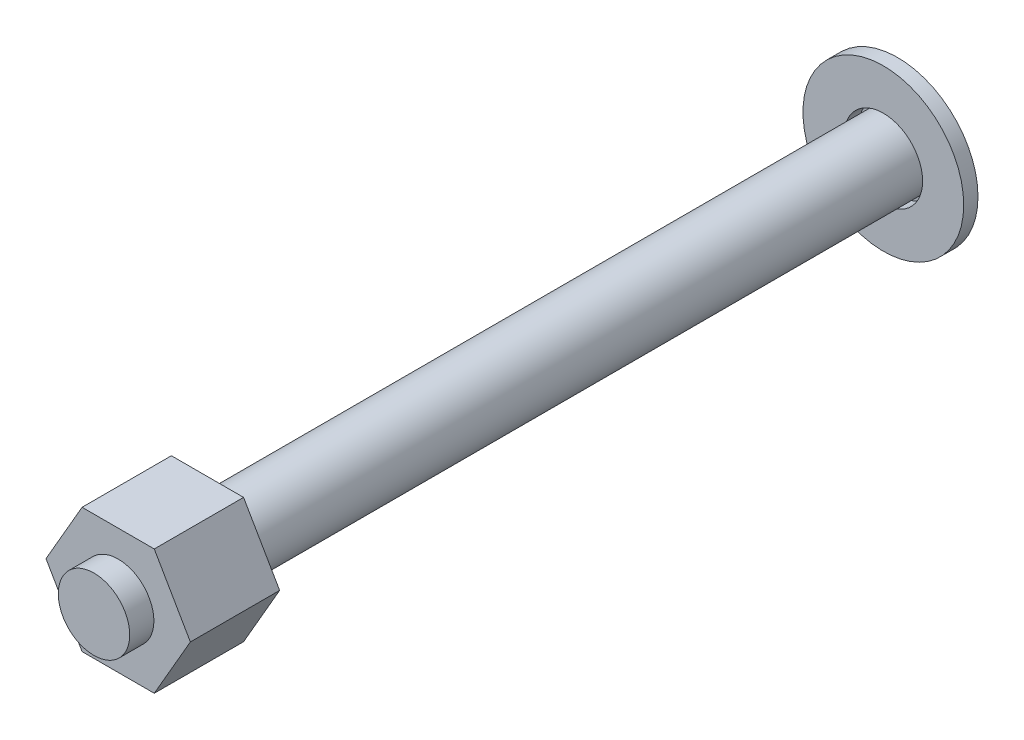
ISO-10303-21;
HEADER;
FILE_DESCRIPTION(('STEP AP214'),'2;1');
FILE_NAME('part.step','',(''),(''),'','','');
FILE_SCHEMA(('AUTOMOTIVE_DESIGN { 1 0 10303 214 1 1 1 1 }'));
ENDSEC;
DATA;
#1=APPLICATION_CONTEXT('core data for automotive mechanical design processes');
#2=APPLICATION_PROTOCOL_DEFINITION('international standard','automotive_design',2000,#1);
#3=PRODUCT_CONTEXT('',#1,'mechanical');
#4=PRODUCT('Part','Part','',(#3));
#5=PRODUCT_RELATED_PRODUCT_CATEGORY('part','',(#4));
#6=PRODUCT_DEFINITION_FORMATION('','',#4);
#7=PRODUCT_DEFINITION_CONTEXT('part definition',#1,'design');
#8=PRODUCT_DEFINITION('design','',#6,#7);
#9=PRODUCT_DEFINITION_SHAPE('','',#8);
#10=(LENGTH_UNIT() NAMED_UNIT(*) SI_UNIT(.MILLI.,.METRE.));
#11=(NAMED_UNIT(*) PLANE_ANGLE_UNIT() SI_UNIT($,.RADIAN.));
#12=(NAMED_UNIT(*) SI_UNIT($,.STERADIAN.) SOLID_ANGLE_UNIT());
#13=UNCERTAINTY_MEASURE_WITH_UNIT(LENGTH_MEASURE(1.E-05),#10,'distance_accuracy_value','');
#14=(GEOMETRIC_REPRESENTATION_CONTEXT(3) GLOBAL_UNCERTAINTY_ASSIGNED_CONTEXT((#13)) GLOBAL_UNIT_ASSIGNED_CONTEXT((#10,
#11,#12)) REPRESENTATION_CONTEXT('',''));
#15=CARTESIAN_POINT('',(0.,0.,0.));
#16=DIRECTION('',(0.,0.,1.));
#17=DIRECTION('',(1.,0.,0.));
#18=AXIS2_PLACEMENT_3D('',#15,#16,#17);
#19=CARTESIAN_POINT('',(48.7,-49.3,71.2));
#20=DIRECTION('',(0.,0.,1.));
#21=DIRECTION('',(1.,0.,0.));
#22=AXIS2_PLACEMENT_3D('',#19,#20,#21);
#23=PLANE('',#22);
#24=CARTESIAN_POINT('',(48.7,-49.3,71.2));
#25=DIRECTION('',(0.,0.,-1.));
#26=DIRECTION('',(1.,0.,0.));
#27=AXIS2_PLACEMENT_3D('',#24,#25,#26);
#28=CIRCLE('',#27,2.);
#29=CARTESIAN_POINT('',(50.7,-49.3,71.2));
#30=VERTEX_POINT('',#29);
#31=EDGE_CURVE('E9',#30,#30,#28,.T.);
#32=ORIENTED_EDGE('',*,*,#31,.F.);
#33=EDGE_LOOP('',(#32));
#34=FACE_BOUND('',#33,.T.);
#35=ADVANCED_FACE('F14',(#34),#23,.T.);
#36=CARTESIAN_POINT('',(48.7,-49.3,26.2));
#37=DIRECTION('',(0.,0.,1.));
#38=DIRECTION('',(1.,0.,0.));
#39=AXIS2_PLACEMENT_3D('',#36,#37,#38);
#40=CYLINDRICAL_SURFACE('',#39,2.);
#41=CARTESIAN_POINT('',(48.7,-49.3,69.844831730769));
#42=DIRECTION('',(0.,0.,-1.));
#43=DIRECTION('',(1.,0.,0.));
#44=AXIS2_PLACEMENT_3D('',#41,#42,#43);
#45=CIRCLE('',#44,2.);
#46=CARTESIAN_POINT('',(50.7,-49.3,69.844831730769));
#47=VERTEX_POINT('',#46);
#48=EDGE_CURVE('E221',#47,#47,#45,.T.);
#49=ORIENTED_EDGE('',*,*,#48,.F.);
#50=DIRECTION('',(0.,0.,1.));
#51=VECTOR('',#50,1.);
#52=CARTESIAN_POINT('',(50.7,-49.3,26.2));
#53=LINE('',#52,#51);
#54=EDGE_CURVE('E25',#47,#30,#53,.T.);
#55=ORIENTED_EDGE('',*,*,#54,.T.);
#56=ORIENTED_EDGE('',*,*,#31,.T.);
#57=ORIENTED_EDGE('',*,*,#54,.F.);
#58=EDGE_LOOP('',(#49,#55,#56,#57));
#59=FACE_BOUND('',#58,.T.);
#60=ADVANCED_FACE('F398',(#59),#40,.T.);
#61=CARTESIAN_POINT('',(48.7,-49.3,69.844831730769));
#62=DIRECTION('',(0.,0.,1.));
#63=DIRECTION('',(1.,0.,0.));
#64=AXIS2_PLACEMENT_3D('',#61,#62,#63);
#65=PLANE('',#64);
#66=ORIENTED_EDGE('',*,*,#48,.T.);
#67=EDGE_LOOP('',(#66));
#68=FACE_BOUND('',#67,.T.);
#69=DIRECTION('',(0.50000000000019,-0.866025403784329,0.));
#70=VECTOR('',#69,1.);
#71=CARTESIAN_POINT('',(50.720725942164,-45.8,69.844831730769));
#72=LINE('',#71,#70);
#73=CARTESIAN_POINT('',(50.720725942164,-45.8,69.844831730769));
#74=VERTEX_POINT('',#73);
#75=CARTESIAN_POINT('',(52.741451884327,-49.3,69.844831730769));
#76=VERTEX_POINT('',#75);
#77=EDGE_CURVE('E158',#74,#76,#72,.T.);
#78=ORIENTED_EDGE('',*,*,#77,.F.);
#79=DIRECTION('',(1.,0.,0.));
#80=VECTOR('',#79,1.);
#81=CARTESIAN_POINT('',(46.679274057836,-45.8,69.844831730769));
#82=LINE('',#81,#80);
#83=CARTESIAN_POINT('',(46.679274057836,-45.8,69.844831730769));
#84=VERTEX_POINT('',#83);
#85=EDGE_CURVE('E240',#84,#74,#82,.T.);
#86=ORIENTED_EDGE('',*,*,#85,.F.);
#87=DIRECTION('',(0.50000000000019,0.866025403784329,0.));
#88=VECTOR('',#87,1.);
#89=CARTESIAN_POINT('',(44.658548115673,-49.3,69.844831730769));
#90=LINE('',#89,#88);
#91=CARTESIAN_POINT('',(44.658548115673,-49.3,69.844831730769));
#92=VERTEX_POINT('',#91);
#93=EDGE_CURVE('E219',#92,#84,#90,.T.);
#94=ORIENTED_EDGE('',*,*,#93,.F.);
#95=DIRECTION('',(-0.50000000000019,0.866025403784329,0.));
#96=VECTOR('',#95,1.);
#97=CARTESIAN_POINT('',(46.679274057836,-52.8,69.844831730769));
#98=LINE('',#97,#96);
#99=CARTESIAN_POINT('',(46.679274057836,-52.8,69.844831730769));
#100=VERTEX_POINT('',#99);
#101=EDGE_CURVE('E153',#100,#92,#98,.T.);
#102=ORIENTED_EDGE('',*,*,#101,.F.);
#103=DIRECTION('',(-1.,0.,0.));
#104=VECTOR('',#103,1.);
#105=CARTESIAN_POINT('',(50.720725942164,-52.8,69.844831730769));
#106=LINE('',#105,#104);
#107=CARTESIAN_POINT('',(50.720725942164,-52.8,69.844831730769));
#108=VERTEX_POINT('',#107);
#109=EDGE_CURVE('E145',#108,#100,#106,.T.);
#110=ORIENTED_EDGE('',*,*,#109,.F.);
#111=DIRECTION('',(-0.50000000000019,-0.866025403784329,0.));
#112=VECTOR('',#111,1.);
#113=CARTESIAN_POINT('',(52.741451884327,-49.3,69.844831730769));
#114=LINE('',#113,#112);
#115=EDGE_CURVE('E150',#76,#108,#114,.T.);
#116=ORIENTED_EDGE('',*,*,#115,.F.);
#117=EDGE_LOOP('',(#78,#86,#94,#102,#110,#116));
#118=FACE_BOUND('',#117,.T.);
#119=ADVANCED_FACE('F148',(#68,#118),#65,.T.);
#120=CARTESIAN_POINT('',(44.658548115673,-49.3,64.844831730769));
#121=DIRECTION('',(0.866025403784329,-0.50000000000019,0.));
#122=DIRECTION('',(0.,0.,-1.));
#123=AXIS2_PLACEMENT_3D('',#120,#121,#122);
#124=PLANE('',#123);
#125=DIRECTION('',(0.,0.,1.));
#126=VECTOR('',#125,1.);
#127=CARTESIAN_POINT('',(44.658548115673,-49.3,64.844831730769));
#128=LINE('',#127,#126);
#129=CARTESIAN_POINT('',(44.658548115673,-49.3,64.844831730769));
#130=VERTEX_POINT('',#129);
#131=EDGE_CURVE('E222',#130,#92,#128,.T.);
#132=ORIENTED_EDGE('',*,*,#131,.T.);
#133=ORIENTED_EDGE('',*,*,#93,.T.);
#134=DIRECTION('',(0.,0.,1.));
#135=VECTOR('',#134,1.);
#136=CARTESIAN_POINT('',(46.679274057836,-45.8,64.844831730769));
#137=LINE('',#136,#135);
#138=CARTESIAN_POINT('',(46.679274057836,-45.8,64.844831730769));
#139=VERTEX_POINT('',#138);
#140=EDGE_CURVE('E258',#139,#84,#137,.T.);
#141=ORIENTED_EDGE('',*,*,#140,.F.);
#142=DIRECTION('',(0.50000000000019,0.866025403784329,0.));
#143=VECTOR('',#142,1.);
#144=CARTESIAN_POINT('',(44.658548115673,-49.3,64.844831730769));
#145=LINE('',#144,#143);
#146=EDGE_CURVE('E195',#130,#139,#145,.T.);
#147=ORIENTED_EDGE('',*,*,#146,.F.);
#148=EDGE_LOOP('',(#132,#133,#141,#147));
#149=FACE_BOUND('',#148,.T.);
#150=ADVANCED_FACE('F411',(#149),#124,.F.);
#151=CARTESIAN_POINT('',(46.679274057836,-52.8,64.844831730769));
#152=DIRECTION('',(0.866025403784329,0.50000000000019,0.));
#153=DIRECTION('',(0.,0.,-1.));
#154=AXIS2_PLACEMENT_3D('',#151,#152,#153);
#155=PLANE('',#154);
#156=DIRECTION('',(0.,0.,1.));
#157=VECTOR('',#156,1.);
#158=CARTESIAN_POINT('',(46.679274057836,-52.8,64.844831730769));
#159=LINE('',#158,#157);
#160=CARTESIAN_POINT('',(46.679274057836,-52.8,64.844831730769));
#161=VERTEX_POINT('',#160);
#162=EDGE_CURVE('E157',#161,#100,#159,.T.);
#163=ORIENTED_EDGE('',*,*,#162,.T.);
#164=ORIENTED_EDGE('',*,*,#101,.T.);
#165=ORIENTED_EDGE('',*,*,#131,.F.);
#166=DIRECTION('',(-0.50000000000019,0.866025403784329,0.));
#167=VECTOR('',#166,1.);
#168=CARTESIAN_POINT('',(46.679274057836,-52.8,64.844831730769));
#169=LINE('',#168,#167);
#170=EDGE_CURVE('E307',#161,#130,#169,.T.);
#171=ORIENTED_EDGE('',*,*,#170,.F.);
#172=EDGE_LOOP('',(#163,#164,#165,#171));
#173=FACE_BOUND('',#172,.T.);
#174=ADVANCED_FACE('F413',(#173),#155,.F.);
#175=CARTESIAN_POINT('',(46.679274057836,-45.8,64.844831730769));
#176=DIRECTION('',(0.,-1.,0.));
#177=DIRECTION('',(0.,0.,-1.));
#178=AXIS2_PLACEMENT_3D('',#175,#176,#177);
#179=PLANE('',#178);
#180=ORIENTED_EDGE('',*,*,#140,.T.);
#181=ORIENTED_EDGE('',*,*,#85,.T.);
#182=DIRECTION('',(0.,0.,1.));
#183=VECTOR('',#182,1.);
#184=CARTESIAN_POINT('',(50.720725942164,-45.8,64.844831730769));
#185=LINE('',#184,#183);
#186=CARTESIAN_POINT('',(50.720725942164,-45.8,64.844831730769));
#187=VERTEX_POINT('',#186);
#188=EDGE_CURVE('E169',#187,#74,#185,.T.);
#189=ORIENTED_EDGE('',*,*,#188,.F.);
#190=DIRECTION('',(1.,0.,0.));
#191=VECTOR('',#190,1.);
#192=CARTESIAN_POINT('',(46.679274057836,-45.8,64.844831730769));
#193=LINE('',#192,#191);
#194=EDGE_CURVE('E191',#139,#187,#193,.T.);
#195=ORIENTED_EDGE('',*,*,#194,.F.);
#196=EDGE_LOOP('',(#180,#181,#189,#195));
#197=FACE_BOUND('',#196,.T.);
#198=ADVANCED_FACE('F418',(#197),#179,.F.);
#199=CARTESIAN_POINT('',(50.720725942164,-52.8,64.844831730769));
#200=DIRECTION('',(0.,1.,0.));
#201=DIRECTION('',(1.,0.,0.));
#202=AXIS2_PLACEMENT_3D('',#199,#200,#201);
#203=PLANE('',#202);
#204=DIRECTION('',(0.,0.,1.));
#205=VECTOR('',#204,1.);
#206=CARTESIAN_POINT('',(50.720725942164,-52.8,64.844831730769));
#207=LINE('',#206,#205);
#208=CARTESIAN_POINT('',(50.720725942164,-52.8,64.844831730769));
#209=VERTEX_POINT('',#208);
#210=EDGE_CURVE('E161',#209,#108,#207,.T.);
#211=ORIENTED_EDGE('',*,*,#210,.T.);
#212=ORIENTED_EDGE('',*,*,#109,.T.);
#213=ORIENTED_EDGE('',*,*,#162,.F.);
#214=DIRECTION('',(-1.,0.,0.));
#215=VECTOR('',#214,1.);
#216=CARTESIAN_POINT('',(50.720725942164,-52.8,64.844831730769));
#217=LINE('',#216,#215);
#218=EDGE_CURVE('E164',#209,#161,#217,.T.);
#219=ORIENTED_EDGE('',*,*,#218,.F.);
#220=EDGE_LOOP('',(#211,#212,#213,#219));
#221=FACE_BOUND('',#220,.T.);
#222=ADVANCED_FACE('F162',(#221),#203,.F.);
#223=CARTESIAN_POINT('',(50.720725942164,-45.8,64.844831730769));
#224=DIRECTION('',(-0.866025403784329,-0.50000000000019,0.));
#225=DIRECTION('',(-0.50000000000019,0.866025403784329,0.));
#226=AXIS2_PLACEMENT_3D('',#223,#224,#225);
#227=PLANE('',#226);
#228=ORIENTED_EDGE('',*,*,#188,.T.);
#229=ORIENTED_EDGE('',*,*,#77,.T.);
#230=DIRECTION('',(0.,0.,1.));
#231=VECTOR('',#230,1.);
#232=CARTESIAN_POINT('',(52.741451884327,-49.3,64.844831730769));
#233=LINE('',#232,#231);
#234=CARTESIAN_POINT('',(52.741451884327,-49.3,64.844831730769));
#235=VERTEX_POINT('',#234);
#236=EDGE_CURVE('E173',#235,#76,#233,.T.);
#237=ORIENTED_EDGE('',*,*,#236,.F.);
#238=DIRECTION('',(0.50000000000019,-0.866025403784329,0.));
#239=VECTOR('',#238,1.);
#240=CARTESIAN_POINT('',(50.720725942164,-45.8,64.844831730769));
#241=LINE('',#240,#239);
#242=EDGE_CURVE('E180',#187,#235,#241,.T.);
#243=ORIENTED_EDGE('',*,*,#242,.F.);
#244=EDGE_LOOP('',(#228,#229,#237,#243));
#245=FACE_BOUND('',#244,.T.);
#246=ADVANCED_FACE('F16',(#245),#227,.F.);
#247=CARTESIAN_POINT('',(52.741451884327,-49.3,64.844831730769));
#248=DIRECTION('',(-0.866025403784329,0.50000000000019,0.));
#249=DIRECTION('',(0.,0.,1.));
#250=AXIS2_PLACEMENT_3D('',#247,#248,#249);
#251=PLANE('',#250);
#252=ORIENTED_EDGE('',*,*,#236,.T.);
#253=ORIENTED_EDGE('',*,*,#115,.T.);
#254=ORIENTED_EDGE('',*,*,#210,.F.);
#255=DIRECTION('',(-0.50000000000019,-0.866025403784329,0.));
#256=VECTOR('',#255,1.);
#257=CARTESIAN_POINT('',(52.741451884327,-49.3,64.844831730769));
#258=LINE('',#257,#256);
#259=EDGE_CURVE('E350',#235,#209,#258,.T.);
#260=ORIENTED_EDGE('',*,*,#259,.F.);
#261=EDGE_LOOP('',(#252,#253,#254,#260));
#262=FACE_BOUND('',#261,.T.);
#263=ADVANCED_FACE('F171',(#262),#251,.F.);
#264=CARTESIAN_POINT('',(48.7,-49.3,64.844831730769));
#265=DIRECTION('',(0.,0.,1.));
#266=DIRECTION('',(1.,0.,0.));
#267=AXIS2_PLACEMENT_3D('',#264,#265,#266);
#268=PLANE('',#267);
#269=CARTESIAN_POINT('',(48.7,-49.3,64.844831730769));
#270=DIRECTION('',(0.,0.,-1.));
#271=DIRECTION('',(1.,0.,0.));
#272=AXIS2_PLACEMENT_3D('',#269,#270,#271);
#273=CIRCLE('',#272,2.);
#274=CARTESIAN_POINT('',(50.7,-49.3,64.844831730769));
#275=VERTEX_POINT('',#274);
#276=EDGE_CURVE('E296',#275,#275,#273,.T.);
#277=ORIENTED_EDGE('',*,*,#276,.F.);
#278=EDGE_LOOP('',(#277));
#279=FACE_BOUND('',#278,.T.);
#280=ORIENTED_EDGE('',*,*,#259,.T.);
#281=ORIENTED_EDGE('',*,*,#218,.T.);
#282=ORIENTED_EDGE('',*,*,#170,.T.);
#283=ORIENTED_EDGE('',*,*,#146,.T.);
#284=ORIENTED_EDGE('',*,*,#194,.T.);
#285=ORIENTED_EDGE('',*,*,#242,.T.);
#286=EDGE_LOOP('',(#280,#281,#282,#283,#284,#285));
#287=FACE_BOUND('',#286,.T.);
#288=ADVANCED_FACE('F349',(#279,#287),#268,.F.);
#289=CARTESIAN_POINT('',(48.7,-49.3,26.2));
#290=DIRECTION('',(0.,0.,1.));
#291=DIRECTION('',(1.,0.,0.));
#292=AXIS2_PLACEMENT_3D('',#289,#290,#291);
#293=CYLINDRICAL_SURFACE('',#292,2.);
#294=DIRECTION('',(0.,0.,1.));
#295=VECTOR('',#294,1.);
#296=CARTESIAN_POINT('',(50.7,-49.3,26.2));
#297=LINE('',#296,#295);
#298=CARTESIAN_POINT('',(50.7,-49.3,26.2));
#299=VERTEX_POINT('',#298);
#300=EDGE_CURVE('E206',#299,#275,#297,.T.);
#301=ORIENTED_EDGE('',*,*,#300,.F.);
#302=CARTESIAN_POINT('',(48.7,-49.3,26.2));
#303=DIRECTION('',(0.,0.,-1.));
#304=DIRECTION('',(1.,0.,0.));
#305=AXIS2_PLACEMENT_3D('',#302,#303,#304);
#306=CIRCLE('',#305,2.);
#307=EDGE_CURVE('E202',#299,#299,#306,.T.);
#308=ORIENTED_EDGE('',*,*,#307,.F.);
#309=ORIENTED_EDGE('',*,*,#300,.T.);
#310=ORIENTED_EDGE('',*,*,#276,.T.);
#311=EDGE_LOOP('',(#301,#308,#309,#310));
#312=FACE_BOUND('',#311,.T.);
#313=ADVANCED_FACE('F384',(#312),#293,.T.);
#314=CARTESIAN_POINT('',(48.7,-49.3,26.2));
#315=DIRECTION('',(0.,0.,1.));
#316=DIRECTION('',(1.,0.,0.));
#317=AXIS2_PLACEMENT_3D('',#314,#315,#316);
#318=PLANE('',#317);
#319=ORIENTED_EDGE('',*,*,#307,.T.);
#320=EDGE_LOOP('',(#319));
#321=FACE_BOUND('',#320,.T.);
#322=CARTESIAN_POINT('',(48.7,-49.3,26.2));
#323=DIRECTION('',(0.,0.,-1.));
#324=DIRECTION('',(1.,0.,0.));
#325=AXIS2_PLACEMENT_3D('',#322,#323,#324);
#326=CIRCLE('',#325,2.2);
#327=CARTESIAN_POINT('',(50.9,-49.3,26.2));
#328=VERTEX_POINT('',#327);
#329=EDGE_CURVE('E207',#328,#328,#326,.T.);
#330=ORIENTED_EDGE('',*,*,#329,.F.);
#331=EDGE_LOOP('',(#330));
#332=FACE_BOUND('',#331,.T.);
#333=ADVANCED_FACE('F382',(#321,#332),#318,.T.);
#334=CARTESIAN_POINT('',(48.7,-49.3,25.7));
#335=DIRECTION('',(0.,0.,1.));
#336=DIRECTION('',(1.,0.,0.));
#337=AXIS2_PLACEMENT_3D('',#334,#335,#336);
#338=CYLINDRICAL_SURFACE('',#337,2.2);
#339=CARTESIAN_POINT('',(48.7,-49.3,27.));
#340=DIRECTION('',(0.,0.,-1.));
#341=DIRECTION('',(1.,0.,0.));
#342=AXIS2_PLACEMENT_3D('',#339,#340,#341);
#343=CIRCLE('',#342,2.2);
#344=CARTESIAN_POINT('',(50.9,-49.3,27.));
#345=VERTEX_POINT('',#344);
#346=EDGE_CURVE('E244',#345,#345,#343,.T.);
#347=ORIENTED_EDGE('',*,*,#346,.F.);
#348=DIRECTION('',(0.,0.,1.));
#349=VECTOR('',#348,1.);
#350=CARTESIAN_POINT('',(50.9,-49.3,25.7));
#351=LINE('',#350,#349);
#352=EDGE_CURVE('E18',#328,#345,#351,.T.);
#353=ORIENTED_EDGE('',*,*,#352,.F.);
#354=ORIENTED_EDGE('',*,*,#329,.T.);
#355=ORIENTED_EDGE('',*,*,#352,.T.);
#356=EDGE_LOOP('',(#347,#353,#354,#355));
#357=FACE_BOUND('',#356,.T.);
#358=ADVANCED_FACE('F379',(#357),#338,.F.);
#359=CARTESIAN_POINT('',(48.7,-49.3,27.));
#360=DIRECTION('',(0.,0.,1.));
#361=DIRECTION('',(1.,0.,0.));
#362=AXIS2_PLACEMENT_3D('',#359,#360,#361);
#363=PLANE('',#362);
#364=ORIENTED_EDGE('',*,*,#346,.T.);
#365=EDGE_LOOP('',(#364));
#366=FACE_BOUND('',#365,.T.);
#367=CARTESIAN_POINT('',(48.7,-49.3,27.));
#368=DIRECTION('',(0.,0.,-1.));
#369=DIRECTION('',(1.,0.,0.));
#370=AXIS2_PLACEMENT_3D('',#367,#368,#369);
#371=CIRCLE('',#370,4.5);
#372=CARTESIAN_POINT('',(53.2,-49.3,27.));
#373=VERTEX_POINT('',#372);
#374=EDGE_CURVE('E304',#373,#373,#371,.T.);
#375=ORIENTED_EDGE('',*,*,#374,.F.);
#376=EDGE_LOOP('',(#375));
#377=FACE_BOUND('',#376,.T.);
#378=ADVANCED_FACE('F392',(#366,#377),#363,.T.);
#379=CARTESIAN_POINT('',(48.7,-49.3,26.2));
#380=DIRECTION('',(0.,0.,1.));
#381=DIRECTION('',(1.,0.,0.));
#382=AXIS2_PLACEMENT_3D('',#379,#380,#381);
#383=CYLINDRICAL_SURFACE('',#382,4.5);
#384=DIRECTION('',(0.,0.,1.));
#385=VECTOR('',#384,1.);
#386=CARTESIAN_POINT('',(53.2,-49.3,26.2));
#387=LINE('',#386,#385);
#388=CARTESIAN_POINT('',(53.2,-49.3,26.2));
#389=VERTEX_POINT('',#388);
#390=EDGE_CURVE('E200',#389,#373,#387,.T.);
#391=ORIENTED_EDGE('',*,*,#390,.F.);
#392=CARTESIAN_POINT('',(48.7,-49.3,26.2));
#393=DIRECTION('',(0.,0.,-1.));
#394=DIRECTION('',(1.,0.,0.));
#395=AXIS2_PLACEMENT_3D('',#392,#393,#394);
#396=CIRCLE('',#395,4.5);
#397=EDGE_CURVE('E196',#389,#389,#396,.T.);
#398=ORIENTED_EDGE('',*,*,#397,.F.);
#399=ORIENTED_EDGE('',*,*,#390,.T.);
#400=ORIENTED_EDGE('',*,*,#374,.T.);
#401=EDGE_LOOP('',(#391,#398,#399,#400));
#402=FACE_BOUND('',#401,.T.);
#403=ADVANCED_FACE('F616',(#402),#383,.T.);
#404=CARTESIAN_POINT('',(48.7,-49.3,25.3));
#405=DIRECTION('',(0.,0.,1.));
#406=DIRECTION('',(1.,0.,0.));
#407=AXIS2_PLACEMENT_3D('',#404,#405,#406);
#408=PLANE('',#407);
#409=DIRECTION('',(-0.50000000000019,-0.866025403784329,0.));
#410=VECTOR('',#409,1.);
#411=CARTESIAN_POINT('',(50.143375672974,-49.3,25.3));
#412=LINE('',#411,#410);
#413=CARTESIAN_POINT('',(50.143375672974,-49.3,25.3));
#414=VERTEX_POINT('',#413);
#415=CARTESIAN_POINT('',(49.421687836487,-50.55,25.3));
#416=VERTEX_POINT('',#415);
#417=EDGE_CURVE('E201',#414,#416,#412,.T.);
#418=ORIENTED_EDGE('',*,*,#417,.T.);
#419=DIRECTION('',(-1.,0.,0.));
#420=VECTOR('',#419,1.);
#421=CARTESIAN_POINT('',(49.421687836487,-50.55,25.3));
#422=LINE('',#421,#420);
#423=CARTESIAN_POINT('',(47.978312163513,-50.55,25.3));
#424=VERTEX_POINT('',#423);
#425=EDGE_CURVE('E273',#416,#424,#422,.T.);
#426=ORIENTED_EDGE('',*,*,#425,.T.);
#427=DIRECTION('',(-0.50000000000019,0.866025403784329,0.));
#428=VECTOR('',#427,1.);
#429=CARTESIAN_POINT('',(47.978312163513,-50.55,25.3));
#430=LINE('',#429,#428);
#431=CARTESIAN_POINT('',(47.256624327026,-49.3,25.3));
#432=VERTEX_POINT('',#431);
#433=EDGE_CURVE('E211',#424,#432,#430,.T.);
#434=ORIENTED_EDGE('',*,*,#433,.T.);
#435=DIRECTION('',(0.50000000000019,0.866025403784329,0.));
#436=VECTOR('',#435,1.);
#437=CARTESIAN_POINT('',(47.256624327026,-49.3,25.3));
#438=LINE('',#437,#436);
#439=CARTESIAN_POINT('',(47.978312163513,-48.05,25.3));
#440=VERTEX_POINT('',#439);
#441=EDGE_CURVE('E189',#432,#440,#438,.T.);
#442=ORIENTED_EDGE('',*,*,#441,.T.);
#443=DIRECTION('',(1.,0.,0.));
#444=VECTOR('',#443,1.);
#445=CARTESIAN_POINT('',(47.978312163513,-48.05,25.3));
#446=LINE('',#445,#444);
#447=CARTESIAN_POINT('',(49.421687836487,-48.05,25.3));
#448=VERTEX_POINT('',#447);
#449=EDGE_CURVE('E190',#440,#448,#446,.T.);
#450=ORIENTED_EDGE('',*,*,#449,.T.);
#451=DIRECTION('',(0.50000000000019,-0.866025403784329,0.));
#452=VECTOR('',#451,1.);
#453=CARTESIAN_POINT('',(49.421687836487,-48.05,25.3));
#454=LINE('',#453,#452);
#455=EDGE_CURVE('E272',#448,#414,#454,.T.);
#456=ORIENTED_EDGE('',*,*,#455,.T.);
#457=EDGE_LOOP('',(#418,#426,#434,#442,#450,#456));
#458=FACE_BOUND('',#457,.T.);
#459=ADVANCED_FACE('F565',(#458),#408,.F.);
#460=CARTESIAN_POINT('',(48.7,-49.3,26.2));
#461=DIRECTION('',(0.,0.,1.));
#462=DIRECTION('',(1.,0.,0.));
#463=AXIS2_PLACEMENT_3D('',#460,#461,#462);
#464=PLANE('',#463);
#465=CARTESIAN_POINT('',(48.7,-49.3,26.2));
#466=DIRECTION('',(0.,0.,-1.));
#467=DIRECTION('',(1.,0.,0.));
#468=AXIS2_PLACEMENT_3D('',#465,#466,#467);
#469=CIRCLE('',#468,3.8);
#470=CARTESIAN_POINT('',(52.5,-49.3,26.2));
#471=VERTEX_POINT('',#470);
#472=EDGE_CURVE('E184',#471,#471,#469,.T.);
#473=ORIENTED_EDGE('',*,*,#472,.F.);
#474=EDGE_LOOP('',(#473));
#475=FACE_BOUND('',#474,.T.);
#476=ORIENTED_EDGE('',*,*,#397,.T.);
#477=EDGE_LOOP('',(#476));
#478=FACE_BOUND('',#477,.T.);
#479=ADVANCED_FACE('F512',(#475,#478),#464,.F.);
#480=CARTESIAN_POINT('',(50.143375672974,-49.3,23.9));
#481=DIRECTION('',(-0.866025403784329,0.50000000000019,0.));
#482=DIRECTION('',(0.,0.,1.));
#483=AXIS2_PLACEMENT_3D('',#480,#481,#482);
#484=PLANE('',#483);
#485=DIRECTION('',(0.,0.,1.));
#486=VECTOR('',#485,1.);
#487=CARTESIAN_POINT('',(49.421687836487,-50.55,23.9));
#488=LINE('',#487,#486);
#489=CARTESIAN_POINT('',(49.421687836487,-50.55,24.244548883697));
#490=VERTEX_POINT('',#489);
#491=EDGE_CURVE('E276',#490,#416,#488,.T.);
#492=ORIENTED_EDGE('',*,*,#491,.T.);
#493=ORIENTED_EDGE('',*,*,#417,.F.);
#494=DIRECTION('',(0.,0.,1.));
#495=VECTOR('',#494,1.);
#496=CARTESIAN_POINT('',(50.143375672974,-49.3,23.9));
#497=LINE('',#496,#495);
#498=CARTESIAN_POINT('',(50.143375672974,-49.3,24.244548883697));
#499=VERTEX_POINT('',#498);
#500=EDGE_CURVE('E268',#499,#414,#497,.T.);
#501=ORIENTED_EDGE('',*,*,#500,.F.);
#502=CARTESIAN_POINT('',(49.782531754731,-49.925,28.381818181818));
#503=DIRECTION('',(0.866025403784329,-0.50000000000019,0.));
#504=DIRECTION('',(0.50000000000019,0.866025403784329,0.));
#505=AXIS2_PLACEMENT_3D('',#502,#503,#504);
#506=CIRCLE('',#505,4.199741727596);
#507=EDGE_CURVE('E248',#490,#499,#506,.T.);
#508=ORIENTED_EDGE('',*,*,#507,.F.);
#509=EDGE_LOOP('',(#492,#493,#501,#508));
#510=FACE_BOUND('',#509,.T.);
#511=ADVANCED_FACE('F327',(#510),#484,.T.);
#512=CARTESIAN_POINT('',(49.421687836487,-50.55,23.9));
#513=DIRECTION('',(0.,1.,0.));
#514=DIRECTION('',(1.,0.,0.));
#515=AXIS2_PLACEMENT_3D('',#512,#513,#514);
#516=PLANE('',#515);
#517=DIRECTION('',(0.,0.,1.));
#518=VECTOR('',#517,1.);
#519=CARTESIAN_POINT('',(47.978312163513,-50.55,23.9));
#520=LINE('',#519,#518);
#521=CARTESIAN_POINT('',(47.978312163513,-50.55,24.244548883697));
#522=VERTEX_POINT('',#521);
#523=EDGE_CURVE('E214',#522,#424,#520,.T.);
#524=ORIENTED_EDGE('',*,*,#523,.T.);
#525=ORIENTED_EDGE('',*,*,#425,.F.);
#526=ORIENTED_EDGE('',*,*,#491,.F.);
#527=CARTESIAN_POINT('',(48.7,-50.55,28.381818181818));
#528=DIRECTION('',(0.,-1.,0.));
#529=DIRECTION('',(1.,0.,0.));
#530=AXIS2_PLACEMENT_3D('',#527,#528,#529);
#531=CIRCLE('',#530,4.199741727596);
#532=EDGE_CURVE('E262',#522,#490,#531,.T.);
#533=ORIENTED_EDGE('',*,*,#532,.F.);
#534=EDGE_LOOP('',(#524,#525,#526,#533));
#535=FACE_BOUND('',#534,.T.);
#536=ADVANCED_FACE('F322',(#535),#516,.T.);
#537=CARTESIAN_POINT('',(47.978312163513,-50.55,23.9));
#538=DIRECTION('',(0.866025403784329,0.50000000000019,0.));
#539=DIRECTION('',(0.,0.,-1.));
#540=AXIS2_PLACEMENT_3D('',#537,#538,#539);
#541=PLANE('',#540);
#542=DIRECTION('',(0.,0.,1.));
#543=VECTOR('',#542,1.);
#544=CARTESIAN_POINT('',(47.256624327026,-49.3,23.9));
#545=LINE('',#544,#543);
#546=CARTESIAN_POINT('',(47.256624327026,-49.3,24.244548883697));
#547=VERTEX_POINT('',#546);
#548=EDGE_CURVE('E215',#547,#432,#545,.T.);
#549=ORIENTED_EDGE('',*,*,#548,.T.);
#550=ORIENTED_EDGE('',*,*,#433,.F.);
#551=ORIENTED_EDGE('',*,*,#523,.F.);
#552=CARTESIAN_POINT('',(47.617468245269,-49.925,28.381818181818));
#553=DIRECTION('',(-0.866025403784329,-0.50000000000019,0.));
#554=DIRECTION('',(0.50000000000019,-0.866025403784329,0.));
#555=AXIS2_PLACEMENT_3D('',#552,#553,#554);
#556=CIRCLE('',#555,4.199741727596);
#557=EDGE_CURVE('E263',#547,#522,#556,.T.);
#558=ORIENTED_EDGE('',*,*,#557,.F.);
#559=EDGE_LOOP('',(#549,#550,#551,#558));
#560=FACE_BOUND('',#559,.T.);
#561=ADVANCED_FACE('F410',(#560),#541,.T.);
#562=CARTESIAN_POINT('',(47.256624327026,-49.3,23.9));
#563=DIRECTION('',(0.866025403784329,-0.50000000000019,0.));
#564=DIRECTION('',(0.,0.,-1.));
#565=AXIS2_PLACEMENT_3D('',#562,#563,#564);
#566=PLANE('',#565);
#567=DIRECTION('',(0.,0.,1.));
#568=VECTOR('',#567,1.);
#569=CARTESIAN_POINT('',(47.978312163513,-48.05,23.9));
#570=LINE('',#569,#568);
#571=CARTESIAN_POINT('',(47.978312163513,-48.05,24.244548883697));
#572=VERTEX_POINT('',#571);
#573=EDGE_CURVE('E186',#572,#440,#570,.T.);
#574=ORIENTED_EDGE('',*,*,#573,.T.);
#575=ORIENTED_EDGE('',*,*,#441,.F.);
#576=ORIENTED_EDGE('',*,*,#548,.F.);
#577=CARTESIAN_POINT('',(47.617468245269,-48.675,28.381818181818));
#578=DIRECTION('',(-0.866025403784329,0.50000000000019,0.));
#579=DIRECTION('',(-0.50000000000019,-0.866025403784329,0.));
#580=AXIS2_PLACEMENT_3D('',#577,#578,#579);
#581=CIRCLE('',#580,4.199741727596);
#582=EDGE_CURVE('E267',#572,#547,#581,.T.);
#583=ORIENTED_EDGE('',*,*,#582,.F.);
#584=EDGE_LOOP('',(#574,#575,#576,#583));
#585=FACE_BOUND('',#584,.T.);
#586=ADVANCED_FACE('F605',(#585),#566,.T.);
#587=CARTESIAN_POINT('',(47.978312163513,-48.05,23.9));
#588=DIRECTION('',(0.,-1.,0.));
#589=DIRECTION('',(0.,0.,-1.));
#590=AXIS2_PLACEMENT_3D('',#587,#588,#589);
#591=PLANE('',#590);
#592=DIRECTION('',(0.,0.,1.));
#593=VECTOR('',#592,1.);
#594=CARTESIAN_POINT('',(49.421687836487,-48.05,23.9));
#595=LINE('',#594,#593);
#596=CARTESIAN_POINT('',(49.421687836487,-48.05,24.244548883697));
#597=VERTEX_POINT('',#596);
#598=EDGE_CURVE('E297',#597,#448,#595,.T.);
#599=ORIENTED_EDGE('',*,*,#598,.T.);
#600=ORIENTED_EDGE('',*,*,#449,.F.);
#601=ORIENTED_EDGE('',*,*,#573,.F.);
#602=CARTESIAN_POINT('',(48.7,-48.05,28.381818181818));
#603=DIRECTION('',(0.,1.,0.));
#604=DIRECTION('',(-1.,0.,0.));
#605=AXIS2_PLACEMENT_3D('',#602,#603,#604);
#606=CIRCLE('',#605,4.199741727596);
#607=EDGE_CURVE('E280',#597,#572,#606,.T.);
#608=ORIENTED_EDGE('',*,*,#607,.F.);
#609=EDGE_LOOP('',(#599,#600,#601,#608));
#610=FACE_BOUND('',#609,.T.);
#611=ADVANCED_FACE('F502',(#610),#591,.T.);
#612=CARTESIAN_POINT('',(49.421687836487,-48.05,23.9));
#613=DIRECTION('',(-0.866025403784329,-0.50000000000019,0.));
#614=DIRECTION('',(-0.50000000000019,0.866025403784329,0.));
#615=AXIS2_PLACEMENT_3D('',#612,#613,#614);
#616=PLANE('',#615);
#617=ORIENTED_EDGE('',*,*,#500,.T.);
#618=ORIENTED_EDGE('',*,*,#455,.F.);
#619=ORIENTED_EDGE('',*,*,#598,.F.);
#620=CARTESIAN_POINT('',(49.782531754731,-48.675,28.381818181818));
#621=DIRECTION('',(0.866025403784329,0.50000000000019,0.));
#622=DIRECTION('',(-0.50000000000019,0.866025403784329,0.));
#623=AXIS2_PLACEMENT_3D('',#620,#621,#622);
#624=CIRCLE('',#623,4.199741727596);
#625=EDGE_CURVE('E288',#499,#597,#624,.T.);
#626=ORIENTED_EDGE('',*,*,#625,.F.);
#627=EDGE_LOOP('',(#617,#618,#619,#626));
#628=FACE_BOUND('',#627,.T.);
#629=ADVANCED_FACE('F497',(#628),#616,.T.);
#630=CARTESIAN_POINT('',(48.7,-49.3,28.381818181818));
#631=DIRECTION('',(0.,0.,1.));
#632=DIRECTION('',(1.,0.,0.));
#633=AXIS2_PLACEMENT_3D('',#630,#631,#632);
#634=SPHERICAL_SURFACE('',#633,4.381818181818);
#635=ORIENTED_EDGE('',*,*,#625,.T.);
#636=ORIENTED_EDGE('',*,*,#607,.T.);
#637=ORIENTED_EDGE('',*,*,#582,.T.);
#638=ORIENTED_EDGE('',*,*,#557,.T.);
#639=ORIENTED_EDGE('',*,*,#532,.T.);
#640=ORIENTED_EDGE('',*,*,#507,.T.);
#641=CARTESIAN_POINT('',(48.7,-49.3,28.381818181818));
#642=DIRECTION('',(0.,-1.,0.));
#643=DIRECTION('',(1.,0.,0.));
#644=AXIS2_PLACEMENT_3D('',#641,#642,#643);
#645=CIRCLE('',#644,4.381818181818);
#646=EDGE_CURVE('E246',#499,#471,#645,.T.);
#647=ORIENTED_EDGE('',*,*,#646,.T.);
#648=ORIENTED_EDGE('',*,*,#472,.T.);
#649=ORIENTED_EDGE('',*,*,#646,.F.);
#650=EDGE_LOOP('',(#635,#636,#637,#638,#639,#640,#647,#648,#649));
#651=FACE_BOUND('',#650,.T.);
#652=ADVANCED_FACE('F316',(#651),#634,.T.);
#653=CLOSED_SHELL('',(#35,#60,#119,#150,#174,#198,#222,#246,#263,#288,#313,#333,#358,#378,#403,
#459,#479,#511,#536,#561,#586,#611,#629,#652));
#654=MANIFOLD_SOLID_BREP('B1',#653);
#655=ADVANCED_BREP_SHAPE_REPRESENTATION('',(#18,#654),#14);
#656=SHAPE_DEFINITION_REPRESENTATION(#9,#655);
ENDSEC;
END-ISO-10303-21;
